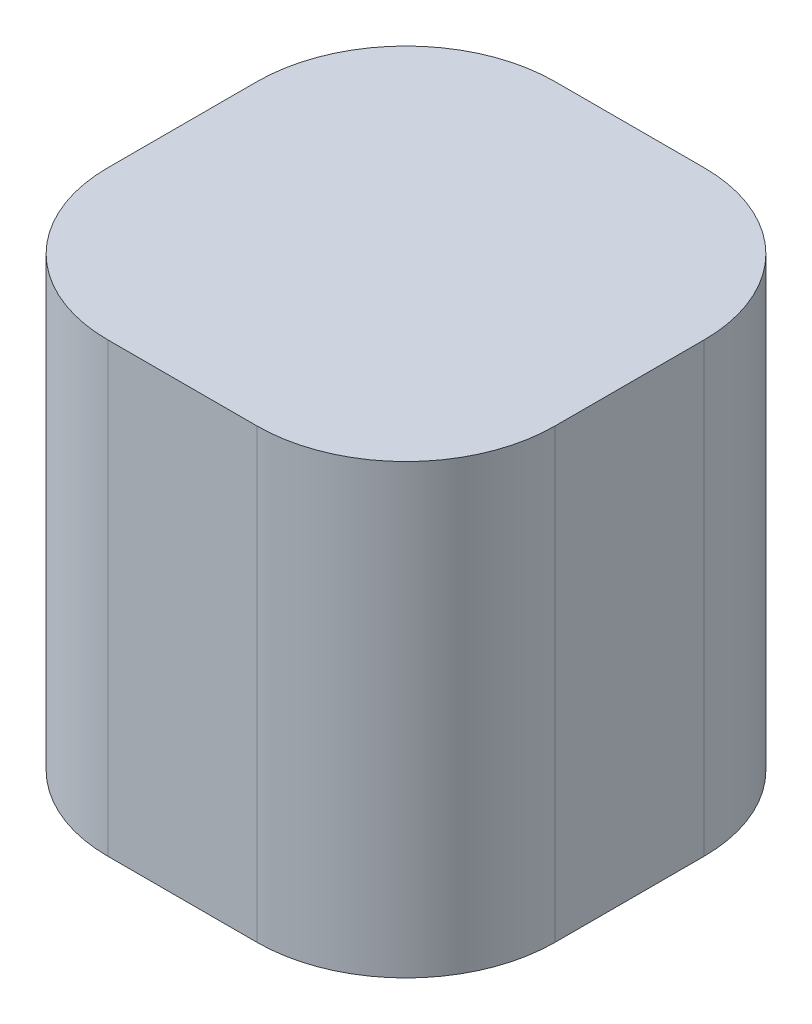
ISO-10303-21;
HEADER;
FILE_DESCRIPTION(('STEP AP214'),'2;1');
FILE_NAME('part.step','',(''),(''),'','','');
FILE_SCHEMA(('AUTOMOTIVE_DESIGN { 1 0 10303 214 1 1 1 1 }'));
ENDSEC;
DATA;
#1=APPLICATION_CONTEXT('core data for automotive mechanical design processes');
#2=APPLICATION_PROTOCOL_DEFINITION('international standard','automotive_design',2000,#1);
#3=PRODUCT_CONTEXT('',#1,'mechanical');
#4=PRODUCT('Part','Part','',(#3));
#5=PRODUCT_RELATED_PRODUCT_CATEGORY('part','',(#4));
#6=PRODUCT_DEFINITION_FORMATION('','',#4);
#7=PRODUCT_DEFINITION_CONTEXT('part definition',#1,'design');
#8=PRODUCT_DEFINITION('design','',#6,#7);
#9=PRODUCT_DEFINITION_SHAPE('','',#8);
#10=(LENGTH_UNIT() NAMED_UNIT(*) SI_UNIT(.MILLI.,.METRE.));
#11=(NAMED_UNIT(*) PLANE_ANGLE_UNIT() SI_UNIT($,.RADIAN.));
#12=(NAMED_UNIT(*) SI_UNIT($,.STERADIAN.) SOLID_ANGLE_UNIT());
#13=UNCERTAINTY_MEASURE_WITH_UNIT(LENGTH_MEASURE(1.E-05),#10,'distance_accuracy_value','');
#14=(GEOMETRIC_REPRESENTATION_CONTEXT(3) GLOBAL_UNCERTAINTY_ASSIGNED_CONTEXT((#13)) GLOBAL_UNIT_ASSIGNED_CONTEXT((#10,
#11,#12)) REPRESENTATION_CONTEXT('',''));
#15=CARTESIAN_POINT('',(0.,0.,0.));
#16=DIRECTION('',(0.,0.,1.));
#17=DIRECTION('',(1.,0.,0.));
#18=AXIS2_PLACEMENT_3D('',#15,#16,#17);
#19=CARTESIAN_POINT('',(-3.,6.,3.));
#20=DIRECTION('',(1.,0.,0.));
#21=DIRECTION('',(0.,0.,-1.));
#22=AXIS2_PLACEMENT_3D('',#19,#20,#21);
#23=PLANE('',#22);
#24=DIRECTION('',(0.,0.,1.));
#25=VECTOR('',#24,1.);
#26=CARTESIAN_POINT('',(-3.,6.,3.));
#27=LINE('',#26,#25);
#28=CARTESIAN_POINT('',(-3.,6.,-1.));
#29=VERTEX_POINT('',#28);
#30=CARTESIAN_POINT('',(-3.,6.,1.));
#31=VERTEX_POINT('',#30);
#32=EDGE_CURVE('E170',#29,#31,#27,.T.);
#33=ORIENTED_EDGE('',*,*,#32,.F.);
#34=DIRECTION('',(0.,-1.,0.));
#35=VECTOR('',#34,1.);
#36=CARTESIAN_POINT('',(-3.,6.,-1.));
#37=LINE('',#36,#35);
#38=CARTESIAN_POINT('',(-3.,0.,-1.));
#39=VERTEX_POINT('',#38);
#40=EDGE_CURVE('E195',#29,#39,#37,.T.);
#41=ORIENTED_EDGE('',*,*,#40,.T.);
#42=DIRECTION('',(0.,0.,1.));
#43=VECTOR('',#42,1.);
#44=CARTESIAN_POINT('',(-3.,0.,3.));
#45=LINE('',#44,#43);
#46=CARTESIAN_POINT('',(-3.,0.,1.));
#47=VERTEX_POINT('',#46);
#48=EDGE_CURVE('E166',#39,#47,#45,.T.);
#49=ORIENTED_EDGE('',*,*,#48,.T.);
#50=DIRECTION('',(0.,-1.,0.));
#51=VECTOR('',#50,1.);
#52=CARTESIAN_POINT('',(-3.,6.,1.));
#53=LINE('',#52,#51);
#54=EDGE_CURVE('E183',#47,#31,#53,.F.);
#55=ORIENTED_EDGE('',*,*,#54,.T.);
#56=EDGE_LOOP('',(#33,#41,#49,#55));
#57=FACE_BOUND('',#56,.T.);
#58=ADVANCED_FACE('F35',(#57),#23,.F.);
#59=CARTESIAN_POINT('',(3.,6.,3.));
#60=DIRECTION('',(0.,0.,-1.));
#61=DIRECTION('',(-1.,0.,0.));
#62=AXIS2_PLACEMENT_3D('',#59,#60,#61);
#63=PLANE('',#62);
#64=DIRECTION('',(1.,0.,0.));
#65=VECTOR('',#64,1.);
#66=CARTESIAN_POINT('',(3.,0.,3.));
#67=LINE('',#66,#65);
#68=CARTESIAN_POINT('',(-1.,0.,3.));
#69=VERTEX_POINT('',#68);
#70=CARTESIAN_POINT('',(1.,0.,3.));
#71=VERTEX_POINT('',#70);
#72=EDGE_CURVE('E186',#69,#71,#67,.T.);
#73=ORIENTED_EDGE('',*,*,#72,.T.);
#74=DIRECTION('',(0.,-1.,0.));
#75=VECTOR('',#74,1.);
#76=CARTESIAN_POINT('',(1.,6.,3.));
#77=LINE('',#76,#75);
#78=CARTESIAN_POINT('',(1.,6.,3.));
#79=VERTEX_POINT('',#78);
#80=EDGE_CURVE('E227',#71,#79,#77,.F.);
#81=ORIENTED_EDGE('',*,*,#80,.T.);
#82=DIRECTION('',(1.,0.,0.));
#83=VECTOR('',#82,1.);
#84=CARTESIAN_POINT('',(3.,6.,3.));
#85=LINE('',#84,#83);
#86=CARTESIAN_POINT('',(-1.,6.,3.));
#87=VERTEX_POINT('',#86);
#88=EDGE_CURVE('E173',#87,#79,#85,.T.);
#89=ORIENTED_EDGE('',*,*,#88,.F.);
#90=DIRECTION('',(0.,-1.,0.));
#91=VECTOR('',#90,1.);
#92=CARTESIAN_POINT('',(-1.,6.,3.));
#93=LINE('',#92,#91);
#94=EDGE_CURVE('E224',#87,#69,#93,.T.);
#95=ORIENTED_EDGE('',*,*,#94,.T.);
#96=EDGE_LOOP('',(#73,#81,#89,#95));
#97=FACE_BOUND('',#96,.T.);
#98=ADVANCED_FACE('F271',(#97),#63,.F.);
#99=CARTESIAN_POINT('',(3.,6.,3.));
#100=DIRECTION('',(-1.,0.,0.));
#101=DIRECTION('',(0.,0.,1.));
#102=AXIS2_PLACEMENT_3D('',#99,#100,#101);
#103=PLANE('',#102);
#104=DIRECTION('',(0.,0.,-1.));
#105=VECTOR('',#104,1.);
#106=CARTESIAN_POINT('',(3.,0.,3.));
#107=LINE('',#106,#105);
#108=CARTESIAN_POINT('',(3.,0.,1.));
#109=VERTEX_POINT('',#108);
#110=CARTESIAN_POINT('',(3.,0.,-1.));
#111=VERTEX_POINT('',#110);
#112=EDGE_CURVE('E189',#109,#111,#107,.T.);
#113=ORIENTED_EDGE('',*,*,#112,.T.);
#114=DIRECTION('',(0.,-1.,0.));
#115=VECTOR('',#114,1.);
#116=CARTESIAN_POINT('',(3.,6.,-1.));
#117=LINE('',#116,#115);
#118=CARTESIAN_POINT('',(3.,6.,-1.));
#119=VERTEX_POINT('',#118);
#120=EDGE_CURVE('E222',#111,#119,#117,.F.);
#121=ORIENTED_EDGE('',*,*,#120,.T.);
#122=DIRECTION('',(0.,0.,-1.));
#123=VECTOR('',#122,1.);
#124=CARTESIAN_POINT('',(3.,6.,3.));
#125=LINE('',#124,#123);
#126=CARTESIAN_POINT('',(3.,6.,1.));
#127=VERTEX_POINT('',#126);
#128=EDGE_CURVE('E177',#127,#119,#125,.T.);
#129=ORIENTED_EDGE('',*,*,#128,.F.);
#130=DIRECTION('',(0.,-1.,0.));
#131=VECTOR('',#130,1.);
#132=CARTESIAN_POINT('',(3.,6.,1.));
#133=LINE('',#132,#131);
#134=EDGE_CURVE('E219',#127,#109,#133,.T.);
#135=ORIENTED_EDGE('',*,*,#134,.T.);
#136=EDGE_LOOP('',(#113,#121,#129,#135));
#137=FACE_BOUND('',#136,.T.);
#138=ADVANCED_FACE('F277',(#137),#103,.F.);
#139=CARTESIAN_POINT('',(3.,6.,-3.));
#140=DIRECTION('',(0.,0.,1.));
#141=DIRECTION('',(1.,0.,0.));
#142=AXIS2_PLACEMENT_3D('',#139,#140,#141);
#143=PLANE('',#142);
#144=DIRECTION('',(-1.,0.,0.));
#145=VECTOR('',#144,1.);
#146=CARTESIAN_POINT('',(3.,0.,-3.));
#147=LINE('',#146,#145);
#148=CARTESIAN_POINT('',(1.,0.,-3.));
#149=VERTEX_POINT('',#148);
#150=CARTESIAN_POINT('',(-1.,0.,-3.));
#151=VERTEX_POINT('',#150);
#152=EDGE_CURVE('E174',#149,#151,#147,.T.);
#153=ORIENTED_EDGE('',*,*,#152,.T.);
#154=DIRECTION('',(0.,-1.,0.));
#155=VECTOR('',#154,1.);
#156=CARTESIAN_POINT('',(-1.,6.,-3.));
#157=LINE('',#156,#155);
#158=CARTESIAN_POINT('',(-1.,6.,-3.));
#159=VERTEX_POINT('',#158);
#160=EDGE_CURVE('E209',#151,#159,#157,.F.);
#161=ORIENTED_EDGE('',*,*,#160,.T.);
#162=DIRECTION('',(-1.,0.,0.));
#163=VECTOR('',#162,1.);
#164=CARTESIAN_POINT('',(3.,6.,-3.));
#165=LINE('',#164,#163);
#166=CARTESIAN_POINT('',(1.,6.,-3.));
#167=VERTEX_POINT('',#166);
#168=EDGE_CURVE('E180',#167,#159,#165,.T.);
#169=ORIENTED_EDGE('',*,*,#168,.F.);
#170=DIRECTION('',(0.,-1.,0.));
#171=VECTOR('',#170,1.);
#172=CARTESIAN_POINT('',(1.,6.,-3.));
#173=LINE('',#172,#171);
#174=EDGE_CURVE('E206',#167,#149,#173,.T.);
#175=ORIENTED_EDGE('',*,*,#174,.T.);
#176=EDGE_LOOP('',(#153,#161,#169,#175));
#177=FACE_BOUND('',#176,.T.);
#178=ADVANCED_FACE('F374',(#177),#143,.F.);
#179=CARTESIAN_POINT('',(0.,6.,0.));
#180=DIRECTION('',(0.,1.,0.));
#181=DIRECTION('',(0.,0.,1.));
#182=AXIS2_PLACEMENT_3D('',#179,#180,#181);
#183=PLANE('',#182);
#184=ORIENTED_EDGE('',*,*,#168,.T.);
#185=CARTESIAN_POINT('',(-1.,6.,-1.));
#186=DIRECTION('',(0.,1.,0.));
#187=DIRECTION('',(0.,0.,1.));
#188=AXIS2_PLACEMENT_3D('',#185,#186,#187);
#189=CIRCLE('',#188,2.);
#190=EDGE_CURVE('E217',#159,#29,#189,.T.);
#191=ORIENTED_EDGE('',*,*,#190,.T.);
#192=ORIENTED_EDGE('',*,*,#32,.T.);
#193=CARTESIAN_POINT('',(-1.,6.,1.));
#194=DIRECTION('',(0.,1.,0.));
#195=DIRECTION('',(0.,0.,1.));
#196=AXIS2_PLACEMENT_3D('',#193,#194,#195);
#197=CIRCLE('',#196,2.);
#198=EDGE_CURVE('E211',#31,#87,#197,.T.);
#199=ORIENTED_EDGE('',*,*,#198,.T.);
#200=ORIENTED_EDGE('',*,*,#88,.T.);
#201=CARTESIAN_POINT('',(1.,6.,1.));
#202=DIRECTION('',(0.,1.,0.));
#203=DIRECTION('',(0.,0.,1.));
#204=AXIS2_PLACEMENT_3D('',#201,#202,#203);
#205=CIRCLE('',#204,2.);
#206=EDGE_CURVE('E213',#79,#127,#205,.T.);
#207=ORIENTED_EDGE('',*,*,#206,.T.);
#208=ORIENTED_EDGE('',*,*,#128,.T.);
#209=CARTESIAN_POINT('',(1.,6.,-1.));
#210=DIRECTION('',(0.,1.,0.));
#211=DIRECTION('',(0.,0.,1.));
#212=AXIS2_PLACEMENT_3D('',#209,#210,#211);
#213=CIRCLE('',#212,2.);
#214=EDGE_CURVE('E215',#119,#167,#213,.T.);
#215=ORIENTED_EDGE('',*,*,#214,.T.);
#216=EDGE_LOOP('',(#184,#191,#192,#199,#200,#207,#208,#215));
#217=FACE_BOUND('',#216,.T.);
#218=ADVANCED_FACE('F364',(#217),#183,.T.);
#219=CARTESIAN_POINT('',(0.,0.,0.));
#220=DIRECTION('',(0.,1.,0.));
#221=DIRECTION('',(0.,0.,1.));
#222=AXIS2_PLACEMENT_3D('',#219,#220,#221);
#223=PLANE('',#222);
#224=DIRECTION('',(-1.,0.,0.));
#225=VECTOR('',#224,1.);
#226=CARTESIAN_POINT('',(0.,0.,-1.3));
#227=LINE('',#226,#225);
#228=CARTESIAN_POINT('',(1.3,0.,-1.3));
#229=VERTEX_POINT('',#228);
#230=CARTESIAN_POINT('',(-1.3,0.,-1.3));
#231=VERTEX_POINT('',#230);
#232=EDGE_CURVE('E230',#229,#231,#227,.T.);
#233=ORIENTED_EDGE('',*,*,#232,.T.);
#234=DIRECTION('',(0.,0.,1.));
#235=VECTOR('',#234,1.);
#236=CARTESIAN_POINT('',(-1.3,0.,0.));
#237=LINE('',#236,#235);
#238=CARTESIAN_POINT('',(-1.3,0.,1.3));
#239=VERTEX_POINT('',#238);
#240=EDGE_CURVE('E236',#231,#239,#237,.T.);
#241=ORIENTED_EDGE('',*,*,#240,.T.);
#242=DIRECTION('',(1.,0.,0.));
#243=VECTOR('',#242,1.);
#244=CARTESIAN_POINT('',(0.,0.,1.3));
#245=LINE('',#244,#243);
#246=CARTESIAN_POINT('',(1.3,0.,1.3));
#247=VERTEX_POINT('',#246);
#248=EDGE_CURVE('E234',#239,#247,#245,.T.);
#249=ORIENTED_EDGE('',*,*,#248,.T.);
#250=DIRECTION('',(0.,0.,-1.));
#251=VECTOR('',#250,1.);
#252=CARTESIAN_POINT('',(1.3,0.,0.));
#253=LINE('',#252,#251);
#254=EDGE_CURVE('E232',#247,#229,#253,.T.);
#255=ORIENTED_EDGE('',*,*,#254,.T.);
#256=EDGE_LOOP('',(#233,#241,#249,#255));
#257=FACE_BOUND('',#256,.T.);
#258=ORIENTED_EDGE('',*,*,#48,.F.);
#259=CARTESIAN_POINT('',(-1.,0.,-1.));
#260=DIRECTION('',(0.,1.,0.));
#261=DIRECTION('',(0.,0.,1.));
#262=AXIS2_PLACEMENT_3D('',#259,#260,#261);
#263=CIRCLE('',#262,2.);
#264=EDGE_CURVE('E204',#39,#151,#263,.F.);
#265=ORIENTED_EDGE('',*,*,#264,.T.);
#266=ORIENTED_EDGE('',*,*,#152,.F.);
#267=CARTESIAN_POINT('',(1.,0.,-1.));
#268=DIRECTION('',(0.,1.,0.));
#269=DIRECTION('',(0.,0.,1.));
#270=AXIS2_PLACEMENT_3D('',#267,#268,#269);
#271=CIRCLE('',#270,2.);
#272=EDGE_CURVE('E202',#149,#111,#271,.F.);
#273=ORIENTED_EDGE('',*,*,#272,.T.);
#274=ORIENTED_EDGE('',*,*,#112,.F.);
#275=CARTESIAN_POINT('',(1.,0.,1.));
#276=DIRECTION('',(0.,1.,0.));
#277=DIRECTION('',(0.,0.,1.));
#278=AXIS2_PLACEMENT_3D('',#275,#276,#277);
#279=CIRCLE('',#278,2.);
#280=EDGE_CURVE('E200',#109,#71,#279,.F.);
#281=ORIENTED_EDGE('',*,*,#280,.T.);
#282=ORIENTED_EDGE('',*,*,#72,.F.);
#283=CARTESIAN_POINT('',(-1.,0.,1.));
#284=DIRECTION('',(0.,1.,0.));
#285=DIRECTION('',(0.,0.,1.));
#286=AXIS2_PLACEMENT_3D('',#283,#284,#285);
#287=CIRCLE('',#286,2.);
#288=EDGE_CURVE('E198',#69,#47,#287,.F.);
#289=ORIENTED_EDGE('',*,*,#288,.T.);
#290=EDGE_LOOP('',(#258,#265,#266,#273,#274,#281,#282,#289));
#291=FACE_BOUND('',#290,.T.);
#292=ADVANCED_FACE('F356',(#257,#291),#223,.F.);
#293=CARTESIAN_POINT('',(-1.,2.5,-1.));
#294=DIRECTION('',(-1.,0.,0.));
#295=DIRECTION('',(0.,0.,1.));
#296=AXIS2_PLACEMENT_3D('',#293,#294,#295);
#297=PLANE('',#296);
#298=DIRECTION('',(0.,-1.,0.));
#299=VECTOR('',#298,1.);
#300=CARTESIAN_POINT('',(-1.,2.5,1.));
#301=LINE('',#300,#299);
#302=CARTESIAN_POINT('',(-1.,2.5,1.));
#303=VERTEX_POINT('',#302);
#304=CARTESIAN_POINT('',(-1.,0.519615242270663,1.));
#305=VERTEX_POINT('',#304);
#306=EDGE_CURVE('E164',#303,#305,#301,.T.);
#307=ORIENTED_EDGE('',*,*,#306,.T.);
#308=DIRECTION('',(0.,0.,-1.));
#309=VECTOR('',#308,1.);
#310=CARTESIAN_POINT('',(-1.,0.519615242270663,-1.));
#311=LINE('',#310,#309);
#312=CARTESIAN_POINT('',(-1.,0.519615242270663,-1.));
#313=VERTEX_POINT('',#312);
#314=EDGE_CURVE('E144',#305,#313,#311,.T.);
#315=ORIENTED_EDGE('',*,*,#314,.T.);
#316=DIRECTION('',(0.,-1.,0.));
#317=VECTOR('',#316,1.);
#318=CARTESIAN_POINT('',(-1.,2.5,-1.));
#319=LINE('',#318,#317);
#320=CARTESIAN_POINT('',(-1.,2.5,-1.));
#321=VERTEX_POINT('',#320);
#322=EDGE_CURVE('E136',#321,#313,#319,.T.);
#323=ORIENTED_EDGE('',*,*,#322,.F.);
#324=DIRECTION('',(0.,0.,-1.));
#325=VECTOR('',#324,1.);
#326=CARTESIAN_POINT('',(-1.,2.5,-1.));
#327=LINE('',#326,#325);
#328=EDGE_CURVE('E141',#303,#321,#327,.T.);
#329=ORIENTED_EDGE('',*,*,#328,.F.);
#330=EDGE_LOOP('',(#307,#315,#323,#329));
#331=FACE_BOUND('',#330,.T.);
#332=ADVANCED_FACE('F139',(#331),#297,.F.);
#333=CARTESIAN_POINT('',(1.,2.5,1.));
#334=DIRECTION('',(0.,0.,1.));
#335=DIRECTION('',(1.,0.,0.));
#336=AXIS2_PLACEMENT_3D('',#333,#334,#335);
#337=PLANE('',#336);
#338=DIRECTION('',(0.,-1.,0.));
#339=VECTOR('',#338,1.);
#340=CARTESIAN_POINT('',(1.,2.5,1.));
#341=LINE('',#340,#339);
#342=CARTESIAN_POINT('',(1.,2.5,1.));
#343=VERTEX_POINT('',#342);
#344=CARTESIAN_POINT('',(1.,0.519615242270663,1.));
#345=VERTEX_POINT('',#344);
#346=EDGE_CURVE('E167',#343,#345,#341,.T.);
#347=ORIENTED_EDGE('',*,*,#346,.T.);
#348=DIRECTION('',(-1.,0.,0.));
#349=VECTOR('',#348,1.);
#350=CARTESIAN_POINT('',(1.,0.519615242270663,1.));
#351=LINE('',#350,#349);
#352=EDGE_CURVE('E239',#345,#305,#351,.T.);
#353=ORIENTED_EDGE('',*,*,#352,.T.);
#354=ORIENTED_EDGE('',*,*,#306,.F.);
#355=DIRECTION('',(-1.,0.,0.));
#356=VECTOR('',#355,1.);
#357=CARTESIAN_POINT('',(1.,2.5,1.));
#358=LINE('',#357,#356);
#359=EDGE_CURVE('E146',#343,#303,#358,.T.);
#360=ORIENTED_EDGE('',*,*,#359,.F.);
#361=EDGE_LOOP('',(#347,#353,#354,#360));
#362=FACE_BOUND('',#361,.T.);
#363=ADVANCED_FACE('F260',(#362),#337,.F.);
#364=CARTESIAN_POINT('',(1.,2.5,-1.));
#365=DIRECTION('',(1.,0.,0.));
#366=DIRECTION('',(0.,0.,-1.));
#367=AXIS2_PLACEMENT_3D('',#364,#365,#366);
#368=PLANE('',#367);
#369=DIRECTION('',(0.,-1.,0.));
#370=VECTOR('',#369,1.);
#371=CARTESIAN_POINT('',(1.,2.5,-1.));
#372=LINE('',#371,#370);
#373=CARTESIAN_POINT('',(1.,2.5,-1.));
#374=VERTEX_POINT('',#373);
#375=CARTESIAN_POINT('',(1.,0.519615242270663,-1.));
#376=VERTEX_POINT('',#375);
#377=EDGE_CURVE('E145',#374,#376,#372,.T.);
#378=ORIENTED_EDGE('',*,*,#377,.T.);
#379=DIRECTION('',(0.,0.,1.));
#380=VECTOR('',#379,1.);
#381=CARTESIAN_POINT('',(1.,0.519615242270663,-1.));
#382=LINE('',#381,#380);
#383=EDGE_CURVE('E44',#376,#345,#382,.T.);
#384=ORIENTED_EDGE('',*,*,#383,.T.);
#385=ORIENTED_EDGE('',*,*,#346,.F.);
#386=DIRECTION('',(0.,0.,1.));
#387=VECTOR('',#386,1.);
#388=CARTESIAN_POINT('',(1.,2.5,-1.));
#389=LINE('',#388,#387);
#390=EDGE_CURVE('E154',#374,#343,#389,.T.);
#391=ORIENTED_EDGE('',*,*,#390,.F.);
#392=EDGE_LOOP('',(#378,#384,#385,#391));
#393=FACE_BOUND('',#392,.T.);
#394=ADVANCED_FACE('F261',(#393),#368,.F.);
#395=CARTESIAN_POINT('',(1.,2.5,-1.));
#396=DIRECTION('',(0.,0.,-1.));
#397=DIRECTION('',(-1.,0.,0.));
#398=AXIS2_PLACEMENT_3D('',#395,#396,#397);
#399=PLANE('',#398);
#400=ORIENTED_EDGE('',*,*,#322,.T.);
#401=DIRECTION('',(1.,0.,0.));
#402=VECTOR('',#401,1.);
#403=CARTESIAN_POINT('',(1.,0.519615242270663,-1.));
#404=LINE('',#403,#402);
#405=EDGE_CURVE('E11',#313,#376,#404,.T.);
#406=ORIENTED_EDGE('',*,*,#405,.T.);
#407=ORIENTED_EDGE('',*,*,#377,.F.);
#408=DIRECTION('',(1.,0.,0.));
#409=VECTOR('',#408,1.);
#410=CARTESIAN_POINT('',(1.,2.5,-1.));
#411=LINE('',#410,#409);
#412=EDGE_CURVE('E149',#321,#374,#411,.T.);
#413=ORIENTED_EDGE('',*,*,#412,.F.);
#414=EDGE_LOOP('',(#400,#406,#407,#413));
#415=FACE_BOUND('',#414,.T.);
#416=ADVANCED_FACE('F150',(#415),#399,.F.);
#417=CARTESIAN_POINT('',(0.,2.5,0.));
#418=DIRECTION('',(0.,-1.,0.));
#419=DIRECTION('',(0.,0.,-1.));
#420=AXIS2_PLACEMENT_3D('',#417,#418,#419);
#421=PLANE('',#420);
#422=ORIENTED_EDGE('',*,*,#328,.T.);
#423=ORIENTED_EDGE('',*,*,#412,.T.);
#424=ORIENTED_EDGE('',*,*,#390,.T.);
#425=ORIENTED_EDGE('',*,*,#359,.T.);
#426=EDGE_LOOP('',(#422,#423,#424,#425));
#427=FACE_BOUND('',#426,.T.);
#428=ADVANCED_FACE('F156',(#427),#421,.T.);
#429=CARTESIAN_POINT('',(-1.,6.,-1.));
#430=DIRECTION('',(0.,-1.,0.));
#431=DIRECTION('',(0.,0.,-1.));
#432=AXIS2_PLACEMENT_3D('',#429,#430,#431);
#433=CYLINDRICAL_SURFACE('',#432,2.);
#434=ORIENTED_EDGE('',*,*,#190,.F.);
#435=ORIENTED_EDGE('',*,*,#160,.F.);
#436=ORIENTED_EDGE('',*,*,#264,.F.);
#437=ORIENTED_EDGE('',*,*,#40,.F.);
#438=EDGE_LOOP('',(#434,#435,#436,#437));
#439=FACE_BOUND('',#438,.T.);
#440=ADVANCED_FACE('F283',(#439),#433,.T.);
#441=CARTESIAN_POINT('',(1.,6.,-1.));
#442=DIRECTION('',(0.,-1.,0.));
#443=DIRECTION('',(0.,0.,-1.));
#444=AXIS2_PLACEMENT_3D('',#441,#442,#443);
#445=CYLINDRICAL_SURFACE('',#444,2.);
#446=ORIENTED_EDGE('',*,*,#214,.F.);
#447=ORIENTED_EDGE('',*,*,#120,.F.);
#448=ORIENTED_EDGE('',*,*,#272,.F.);
#449=ORIENTED_EDGE('',*,*,#174,.F.);
#450=EDGE_LOOP('',(#446,#447,#448,#449));
#451=FACE_BOUND('',#450,.T.);
#452=ADVANCED_FACE('F286',(#451),#445,.T.);
#453=CARTESIAN_POINT('',(1.,6.,1.));
#454=DIRECTION('',(0.,-1.,0.));
#455=DIRECTION('',(0.,0.,-1.));
#456=AXIS2_PLACEMENT_3D('',#453,#454,#455);
#457=CYLINDRICAL_SURFACE('',#456,2.);
#458=ORIENTED_EDGE('',*,*,#206,.F.);
#459=ORIENTED_EDGE('',*,*,#80,.F.);
#460=ORIENTED_EDGE('',*,*,#280,.F.);
#461=ORIENTED_EDGE('',*,*,#134,.F.);
#462=EDGE_LOOP('',(#458,#459,#460,#461));
#463=FACE_BOUND('',#462,.T.);
#464=ADVANCED_FACE('F290',(#463),#457,.T.);
#465=CARTESIAN_POINT('',(-1.,6.,1.));
#466=DIRECTION('',(0.,-1.,0.));
#467=DIRECTION('',(0.,0.,-1.));
#468=AXIS2_PLACEMENT_3D('',#465,#466,#467);
#469=CYLINDRICAL_SURFACE('',#468,2.);
#470=ORIENTED_EDGE('',*,*,#198,.F.);
#471=ORIENTED_EDGE('',*,*,#54,.F.);
#472=ORIENTED_EDGE('',*,*,#288,.F.);
#473=ORIENTED_EDGE('',*,*,#94,.F.);
#474=EDGE_LOOP('',(#470,#471,#472,#473));
#475=FACE_BOUND('',#474,.T.);
#476=ADVANCED_FACE('F294',(#475),#469,.T.);
#477=CARTESIAN_POINT('',(1.,0.519615242270663,-1.));
#478=DIRECTION('',(0.866025403784437,0.500000000000002,0.));
#479=DIRECTION('',(0.,0.,1.));
#480=AXIS2_PLACEMENT_3D('',#477,#478,#479);
#481=PLANE('',#480);
#482=DIRECTION('',(-0.44721359549996,0.774596669241482,0.447213595499959));
#483=VECTOR('',#482,1.);
#484=CARTESIAN_POINT('',(1.,0.519615242270663,-1.));
#485=LINE('',#484,#483);
#486=EDGE_CURVE('E160',#229,#376,#485,.T.);
#487=ORIENTED_EDGE('',*,*,#486,.F.);
#488=ORIENTED_EDGE('',*,*,#254,.F.);
#489=DIRECTION('',(-0.44721359549996,0.774596669241481,-0.44721359549996));
#490=VECTOR('',#489,1.);
#491=CARTESIAN_POINT('',(1.,0.519615242270663,1.));
#492=LINE('',#491,#490);
#493=EDGE_CURVE('E39',#345,#247,#492,.F.);
#494=ORIENTED_EDGE('',*,*,#493,.F.);
#495=ORIENTED_EDGE('',*,*,#383,.F.);
#496=EDGE_LOOP('',(#487,#488,#494,#495));
#497=FACE_BOUND('',#496,.T.);
#498=ADVANCED_FACE('F37',(#497),#481,.F.);
#499=CARTESIAN_POINT('',(1.,0.519615242270663,1.));
#500=DIRECTION('',(0.,0.500000000000002,0.866025403784437));
#501=DIRECTION('',(-1.,0.,0.));
#502=AXIS2_PLACEMENT_3D('',#499,#500,#501);
#503=PLANE('',#502);
#504=ORIENTED_EDGE('',*,*,#493,.T.);
#505=ORIENTED_EDGE('',*,*,#248,.F.);
#506=DIRECTION('',(0.44721359549996,0.774596669241481,-0.44721359549996));
#507=VECTOR('',#506,1.);
#508=CARTESIAN_POINT('',(-0.599999999999997,1.21243556529821,0.599999999999996));
#509=LINE('',#508,#507);
#510=EDGE_CURVE('E244',#305,#239,#509,.F.);
#511=ORIENTED_EDGE('',*,*,#510,.F.);
#512=ORIENTED_EDGE('',*,*,#352,.F.);
#513=EDGE_LOOP('',(#504,#505,#511,#512));
#514=FACE_BOUND('',#513,.T.);
#515=ADVANCED_FACE('F258',(#514),#503,.F.);
#516=CARTESIAN_POINT('',(1.,0.519615242270663,-1.));
#517=DIRECTION('',(0.,0.500000000000002,-0.866025403784437));
#518=DIRECTION('',(1.,0.,0.));
#519=AXIS2_PLACEMENT_3D('',#516,#517,#518);
#520=PLANE('',#519);
#521=ORIENTED_EDGE('',*,*,#486,.T.);
#522=ORIENTED_EDGE('',*,*,#405,.F.);
#523=DIRECTION('',(-0.44721359549996,-0.774596669241482,-0.44721359549996));
#524=VECTOR('',#523,1.);
#525=CARTESIAN_POINT('',(-1.,0.519615242270663,-1.));
#526=LINE('',#525,#524);
#527=EDGE_CURVE('E242',#231,#313,#526,.F.);
#528=ORIENTED_EDGE('',*,*,#527,.F.);
#529=ORIENTED_EDGE('',*,*,#232,.F.);
#530=EDGE_LOOP('',(#521,#522,#528,#529));
#531=FACE_BOUND('',#530,.T.);
#532=ADVANCED_FACE('F249',(#531),#520,.F.);
#533=CARTESIAN_POINT('',(-1.,0.519615242270663,-1.));
#534=DIRECTION('',(-0.866025403784437,0.500000000000002,0.));
#535=DIRECTION('',(0.,0.,-1.));
#536=AXIS2_PLACEMENT_3D('',#533,#534,#535);
#537=PLANE('',#536);
#538=ORIENTED_EDGE('',*,*,#510,.T.);
#539=ORIENTED_EDGE('',*,*,#240,.F.);
#540=ORIENTED_EDGE('',*,*,#527,.T.);
#541=ORIENTED_EDGE('',*,*,#314,.F.);
#542=EDGE_LOOP('',(#538,#539,#540,#541));
#543=FACE_BOUND('',#542,.T.);
#544=ADVANCED_FACE('F299',(#543),#537,.F.);
#545=CLOSED_SHELL('',(#58,#98,#138,#178,#218,#292,#332,#363,#394,#416,#428,#440,#452,#464,#476,
#498,#515,#532,#544));
#546=MANIFOLD_SOLID_BREP('B2',#545);
#547=ADVANCED_BREP_SHAPE_REPRESENTATION('',(#18,#546),#14);
#548=SHAPE_DEFINITION_REPRESENTATION(#9,#547);
ENDSEC;
END-ISO-10303-21;
